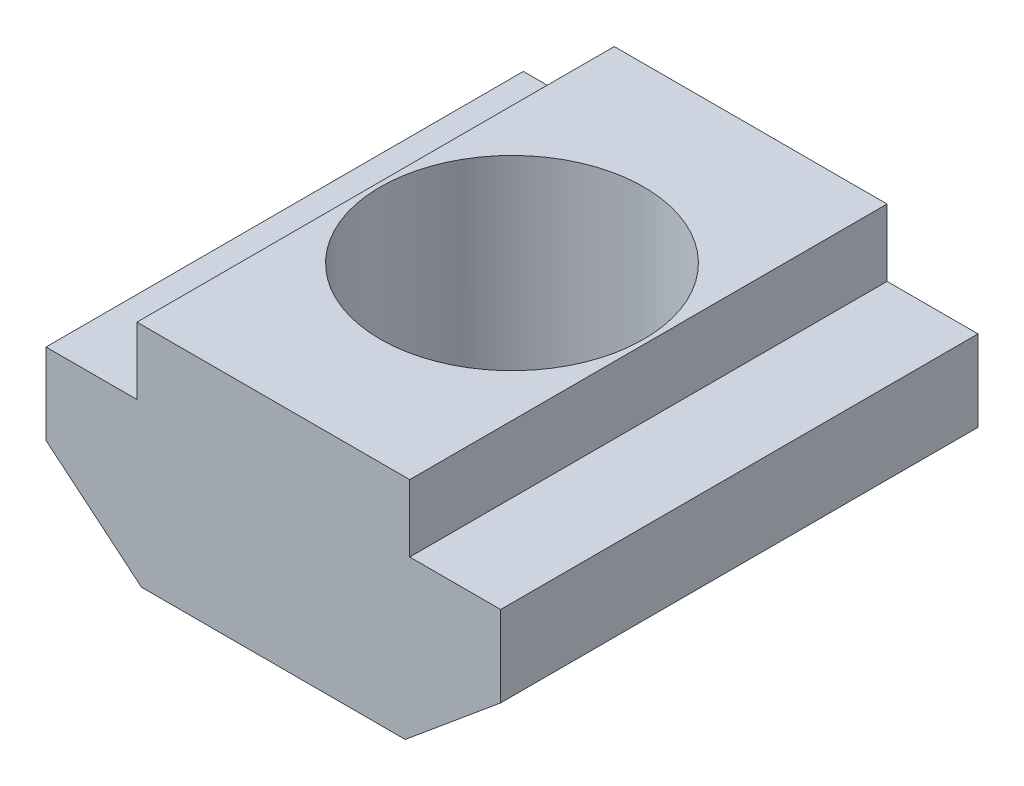
ISO-10303-21;
HEADER;
FILE_DESCRIPTION(('STEP AP214'),'2;1');
FILE_NAME('part.step','',(''),(''),'','','');
FILE_SCHEMA(('AUTOMOTIVE_DESIGN { 1 0 10303 214 1 1 1 1 }'));
ENDSEC;
DATA;
#1=APPLICATION_CONTEXT('core data for automotive mechanical design processes');
#2=APPLICATION_PROTOCOL_DEFINITION('international standard','automotive_design',2000,#1);
#3=PRODUCT_CONTEXT('',#1,'mechanical');
#4=PRODUCT('Part','Part','',(#3));
#5=PRODUCT_RELATED_PRODUCT_CATEGORY('part','',(#4));
#6=PRODUCT_DEFINITION_FORMATION('','',#4);
#7=PRODUCT_DEFINITION_CONTEXT('part definition',#1,'design');
#8=PRODUCT_DEFINITION('design','',#6,#7);
#9=PRODUCT_DEFINITION_SHAPE('','',#8);
#10=(LENGTH_UNIT() NAMED_UNIT(*) SI_UNIT(.MILLI.,.METRE.));
#11=(NAMED_UNIT(*) PLANE_ANGLE_UNIT() SI_UNIT($,.RADIAN.));
#12=(NAMED_UNIT(*) SI_UNIT($,.STERADIAN.) SOLID_ANGLE_UNIT());
#13=UNCERTAINTY_MEASURE_WITH_UNIT(LENGTH_MEASURE(1.E-05),#10,'distance_accuracy_value','');
#14=(GEOMETRIC_REPRESENTATION_CONTEXT(3) GLOBAL_UNCERTAINTY_ASSIGNED_CONTEXT((#13)) GLOBAL_UNIT_ASSIGNED_CONTEXT((#10,
#11,#12)) REPRESENTATION_CONTEXT('',''));
#15=CARTESIAN_POINT('',(0.,0.,0.));
#16=DIRECTION('',(0.,0.,1.));
#17=DIRECTION('',(1.,0.,0.));
#18=AXIS2_PLACEMENT_3D('',#15,#16,#17);
#19=CARTESIAN_POINT('',(-2.9,-2.5,10.5));
#20=DIRECTION('',(0.,1.,0.));
#21=DIRECTION('',(0.,0.,1.));
#22=AXIS2_PLACEMENT_3D('',#19,#20,#21);
#23=PLANE('',#22);
#24=DIRECTION('',(0.,0.,-1.));
#25=VECTOR('',#24,1.);
#26=CARTESIAN_POINT('',(2.9,-2.5,10.5));
#27=LINE('',#26,#25);
#28=CARTESIAN_POINT('',(2.9,-2.5,5.25));
#29=VERTEX_POINT('',#28);
#30=CARTESIAN_POINT('',(2.9,-2.5,0.));
#31=VERTEX_POINT('',#30);
#32=EDGE_CURVE('E101',#29,#31,#27,.T.);
#33=ORIENTED_EDGE('',*,*,#32,.F.);
#34=CARTESIAN_POINT('',(0.,-2.5,5.25));
#35=DIRECTION('',(0.,1.,0.));
#36=DIRECTION('',(0.,0.,1.));
#37=AXIS2_PLACEMENT_3D('',#34,#35,#36);
#38=CIRCLE('',#37,2.9);
#39=CARTESIAN_POINT('',(-2.9,-2.5,5.25));
#40=VERTEX_POINT('',#39);
#41=EDGE_CURVE('E53',#29,#40,#38,.T.);
#42=ORIENTED_EDGE('',*,*,#41,.T.);
#43=DIRECTION('',(0.,0.,-1.));
#44=VECTOR('',#43,1.);
#45=CARTESIAN_POINT('',(-2.9,-2.5,10.5));
#46=LINE('',#45,#44);
#47=CARTESIAN_POINT('',(-2.9,-2.5,0.));
#48=VERTEX_POINT('',#47);
#49=EDGE_CURVE('E182',#40,#48,#46,.T.);
#50=ORIENTED_EDGE('',*,*,#49,.T.);
#51=DIRECTION('',(1.,0.,0.));
#52=VECTOR('',#51,1.);
#53=CARTESIAN_POINT('',(-2.9,-2.5,0.));
#54=LINE('',#53,#52);
#55=EDGE_CURVE('E177',#48,#31,#54,.T.);
#56=ORIENTED_EDGE('',*,*,#55,.T.);
#57=EDGE_LOOP('',(#33,#42,#50,#56));
#58=FACE_BOUND('',#57,.T.);
#59=ADVANCED_FACE('F39',(#58),#23,.F.);
#60=CARTESIAN_POINT('',(2.9,-2.5,10.5));
#61=DIRECTION('',(-0.639326483940865,0.768935398412513,0.));
#62=DIRECTION('',(-0.768935398412514,-0.639326483940865,0.));
#63=AXIS2_PLACEMENT_3D('',#60,#61,#62);
#64=PLANE('',#63);
#65=DIRECTION('',(0.768935398412514,0.639326483940865,0.));
#66=VECTOR('',#65,1.);
#67=CARTESIAN_POINT('',(2.9,-2.5,0.));
#68=LINE('',#67,#66);
#69=CARTESIAN_POINT('',(5.,-0.753968253968255,0.));
#70=VERTEX_POINT('',#69);
#71=EDGE_CURVE('E160',#31,#70,#68,.T.);
#72=ORIENTED_EDGE('',*,*,#71,.T.);
#73=DIRECTION('',(0.,0.,-1.));
#74=VECTOR('',#73,1.);
#75=CARTESIAN_POINT('',(5.,-0.753968253968255,10.5));
#76=LINE('',#75,#74);
#77=CARTESIAN_POINT('',(5.,-0.753968253968255,10.5));
#78=VERTEX_POINT('',#77);
#79=EDGE_CURVE('E47',#78,#70,#76,.T.);
#80=ORIENTED_EDGE('',*,*,#79,.F.);
#81=DIRECTION('',(0.768935398412514,0.639326483940865,0.));
#82=VECTOR('',#81,1.);
#83=CARTESIAN_POINT('',(2.9,-2.5,10.5));
#84=LINE('',#83,#82);
#85=CARTESIAN_POINT('',(2.9,-2.5,10.5));
#86=VERTEX_POINT('',#85);
#87=EDGE_CURVE('E179',#86,#78,#84,.T.);
#88=ORIENTED_EDGE('',*,*,#87,.F.);
#89=EDGE_CURVE('E180',#86,#29,#27,.T.);
#90=ORIENTED_EDGE('',*,*,#89,.T.);
#91=ORIENTED_EDGE('',*,*,#32,.T.);
#92=EDGE_LOOP('',(#72,#80,#88,#90,#91));
#93=FACE_BOUND('',#92,.T.);
#94=ADVANCED_FACE('F41',(#93),#64,.F.);
#95=CARTESIAN_POINT('',(5.,-0.753968253968255,10.5));
#96=DIRECTION('',(-1.,0.,0.));
#97=DIRECTION('',(0.,0.,1.));
#98=AXIS2_PLACEMENT_3D('',#95,#96,#97);
#99=PLANE('',#98);
#100=DIRECTION('',(0.,1.,0.));
#101=VECTOR('',#100,1.);
#102=CARTESIAN_POINT('',(5.,-0.753968253968255,0.));
#103=LINE('',#102,#101);
#104=CARTESIAN_POINT('',(5.,1.02603174603174,0.));
#105=VERTEX_POINT('',#104);
#106=EDGE_CURVE('E162',#70,#105,#103,.T.);
#107=ORIENTED_EDGE('',*,*,#106,.T.);
#108=DIRECTION('',(0.,0.,-1.));
#109=VECTOR('',#108,1.);
#110=CARTESIAN_POINT('',(5.,1.02603174603174,10.5));
#111=LINE('',#110,#109);
#112=CARTESIAN_POINT('',(5.,1.02603174603174,10.5));
#113=VERTEX_POINT('',#112);
#114=EDGE_CURVE('E197',#113,#105,#111,.T.);
#115=ORIENTED_EDGE('',*,*,#114,.F.);
#116=DIRECTION('',(0.,1.,0.));
#117=VECTOR('',#116,1.);
#118=CARTESIAN_POINT('',(5.,-0.753968253968255,10.5));
#119=LINE('',#118,#117);
#120=EDGE_CURVE('E110',#78,#113,#119,.T.);
#121=ORIENTED_EDGE('',*,*,#120,.F.);
#122=ORIENTED_EDGE('',*,*,#79,.T.);
#123=EDGE_LOOP('',(#107,#115,#121,#122));
#124=FACE_BOUND('',#123,.T.);
#125=ADVANCED_FACE('F200',(#124),#99,.F.);
#126=CARTESIAN_POINT('',(5.,1.02603174603174,10.5));
#127=DIRECTION('',(0.,-1.,0.));
#128=DIRECTION('',(0.,0.,-1.));
#129=AXIS2_PLACEMENT_3D('',#126,#127,#128);
#130=PLANE('',#129);
#131=DIRECTION('',(-1.,0.,0.));
#132=VECTOR('',#131,1.);
#133=CARTESIAN_POINT('',(5.,1.02603174603174,0.));
#134=LINE('',#133,#132);
#135=CARTESIAN_POINT('',(3.,1.02603174603174,0.));
#136=VERTEX_POINT('',#135);
#137=EDGE_CURVE('E164',#105,#136,#134,.T.);
#138=ORIENTED_EDGE('',*,*,#137,.T.);
#139=DIRECTION('',(0.,0.,-1.));
#140=VECTOR('',#139,1.);
#141=CARTESIAN_POINT('',(3.,1.02603174603174,10.5));
#142=LINE('',#141,#140);
#143=CARTESIAN_POINT('',(3.,1.02603174603174,10.5));
#144=VERTEX_POINT('',#143);
#145=EDGE_CURVE('E194',#144,#136,#142,.T.);
#146=ORIENTED_EDGE('',*,*,#145,.F.);
#147=DIRECTION('',(-1.,0.,0.));
#148=VECTOR('',#147,1.);
#149=CARTESIAN_POINT('',(5.,1.02603174603174,10.5));
#150=LINE('',#149,#148);
#151=EDGE_CURVE('E220',#113,#144,#150,.T.);
#152=ORIENTED_EDGE('',*,*,#151,.F.);
#153=ORIENTED_EDGE('',*,*,#114,.T.);
#154=EDGE_LOOP('',(#138,#146,#152,#153));
#155=FACE_BOUND('',#154,.T.);
#156=ADVANCED_FACE('F211',(#155),#130,.F.);
#157=CARTESIAN_POINT('',(3.,1.02603174603174,10.5));
#158=DIRECTION('',(-1.,0.,0.));
#159=DIRECTION('',(0.,0.,1.));
#160=AXIS2_PLACEMENT_3D('',#157,#158,#159);
#161=PLANE('',#160);
#162=DIRECTION('',(0.,1.,0.));
#163=VECTOR('',#162,1.);
#164=CARTESIAN_POINT('',(3.,1.02603174603174,0.));
#165=LINE('',#164,#163);
#166=CARTESIAN_POINT('',(3.,2.5,0.));
#167=VERTEX_POINT('',#166);
#168=EDGE_CURVE('E166',#136,#167,#165,.T.);
#169=ORIENTED_EDGE('',*,*,#168,.T.);
#170=DIRECTION('',(0.,0.,-1.));
#171=VECTOR('',#170,1.);
#172=CARTESIAN_POINT('',(3.,2.5,10.5));
#173=LINE('',#172,#171);
#174=CARTESIAN_POINT('',(3.,2.5,10.5));
#175=VERTEX_POINT('',#174);
#176=EDGE_CURVE('E191',#175,#167,#173,.T.);
#177=ORIENTED_EDGE('',*,*,#176,.F.);
#178=DIRECTION('',(0.,1.,0.));
#179=VECTOR('',#178,1.);
#180=CARTESIAN_POINT('',(3.,1.02603174603174,10.5));
#181=LINE('',#180,#179);
#182=EDGE_CURVE('E217',#144,#175,#181,.T.);
#183=ORIENTED_EDGE('',*,*,#182,.F.);
#184=ORIENTED_EDGE('',*,*,#145,.T.);
#185=EDGE_LOOP('',(#169,#177,#183,#184));
#186=FACE_BOUND('',#185,.T.);
#187=ADVANCED_FACE('F215',(#186),#161,.F.);
#188=CARTESIAN_POINT('',(-3.,2.5,10.5));
#189=DIRECTION('',(0.,-1.,0.));
#190=DIRECTION('',(0.,0.,-1.));
#191=AXIS2_PLACEMENT_3D('',#188,#189,#190);
#192=PLANE('',#191);
#193=CARTESIAN_POINT('',(0.,2.5,5.25));
#194=DIRECTION('',(0.,1.,0.));
#195=DIRECTION('',(0.,0.,1.));
#196=AXIS2_PLACEMENT_3D('',#193,#194,#195);
#197=CIRCLE('',#196,2.9);
#198=CARTESIAN_POINT('',(0.,2.5,8.15));
#199=VERTEX_POINT('',#198);
#200=EDGE_CURVE('E241',#199,#199,#197,.T.);
#201=ORIENTED_EDGE('',*,*,#200,.F.);
#202=EDGE_LOOP('',(#201));
#203=FACE_BOUND('',#202,.T.);
#204=DIRECTION('',(-1.,0.,0.));
#205=VECTOR('',#204,1.);
#206=CARTESIAN_POINT('',(-3.,2.5,0.));
#207=LINE('',#206,#205);
#208=CARTESIAN_POINT('',(-3.,2.5,0.));
#209=VERTEX_POINT('',#208);
#210=EDGE_CURVE('E168',#167,#209,#207,.T.);
#211=ORIENTED_EDGE('',*,*,#210,.T.);
#212=DIRECTION('',(0.,0.,-1.));
#213=VECTOR('',#212,1.);
#214=CARTESIAN_POINT('',(-3.,2.5,10.5));
#215=LINE('',#214,#213);
#216=CARTESIAN_POINT('',(-3.,2.5,10.5));
#217=VERTEX_POINT('',#216);
#218=EDGE_CURVE('E188',#217,#209,#215,.T.);
#219=ORIENTED_EDGE('',*,*,#218,.F.);
#220=DIRECTION('',(-1.,0.,0.));
#221=VECTOR('',#220,1.);
#222=CARTESIAN_POINT('',(-3.,2.5,10.5));
#223=LINE('',#222,#221);
#224=EDGE_CURVE('E219',#175,#217,#223,.T.);
#225=ORIENTED_EDGE('',*,*,#224,.F.);
#226=ORIENTED_EDGE('',*,*,#176,.T.);
#227=EDGE_LOOP('',(#211,#219,#225,#226));
#228=FACE_BOUND('',#227,.T.);
#229=ADVANCED_FACE('F266',(#203,#228),#192,.F.);
#230=CARTESIAN_POINT('',(-3.,1.02603174603174,10.5));
#231=DIRECTION('',(1.,0.,0.));
#232=DIRECTION('',(0.,0.,-1.));
#233=AXIS2_PLACEMENT_3D('',#230,#231,#232);
#234=PLANE('',#233);
#235=DIRECTION('',(0.,-1.,0.));
#236=VECTOR('',#235,1.);
#237=CARTESIAN_POINT('',(-3.,1.02603174603174,0.));
#238=LINE('',#237,#236);
#239=CARTESIAN_POINT('',(-3.,1.02603174603174,0.));
#240=VERTEX_POINT('',#239);
#241=EDGE_CURVE('E170',#209,#240,#238,.T.);
#242=ORIENTED_EDGE('',*,*,#241,.T.);
#243=DIRECTION('',(0.,0.,-1.));
#244=VECTOR('',#243,1.);
#245=CARTESIAN_POINT('',(-3.,1.02603174603174,10.5));
#246=LINE('',#245,#244);
#247=CARTESIAN_POINT('',(-3.,1.02603174603174,10.5));
#248=VERTEX_POINT('',#247);
#249=EDGE_CURVE('E185',#248,#240,#246,.T.);
#250=ORIENTED_EDGE('',*,*,#249,.F.);
#251=DIRECTION('',(0.,-1.,0.));
#252=VECTOR('',#251,1.);
#253=CARTESIAN_POINT('',(-3.,1.02603174603174,10.5));
#254=LINE('',#253,#252);
#255=EDGE_CURVE('E222',#217,#248,#254,.T.);
#256=ORIENTED_EDGE('',*,*,#255,.F.);
#257=ORIENTED_EDGE('',*,*,#218,.T.);
#258=EDGE_LOOP('',(#242,#250,#256,#257));
#259=FACE_BOUND('',#258,.T.);
#260=ADVANCED_FACE('F231',(#259),#234,.F.);
#261=CARTESIAN_POINT('',(-5.,1.02603174603174,10.5));
#262=DIRECTION('',(0.,-1.,0.));
#263=DIRECTION('',(0.,0.,-1.));
#264=AXIS2_PLACEMENT_3D('',#261,#262,#263);
#265=PLANE('',#264);
#266=DIRECTION('',(-1.,0.,0.));
#267=VECTOR('',#266,1.);
#268=CARTESIAN_POINT('',(-5.,1.02603174603174,0.));
#269=LINE('',#268,#267);
#270=CARTESIAN_POINT('',(-5.,1.02603174603174,0.));
#271=VERTEX_POINT('',#270);
#272=EDGE_CURVE('E172',#240,#271,#269,.T.);
#273=ORIENTED_EDGE('',*,*,#272,.T.);
#274=DIRECTION('',(0.,0.,-1.));
#275=VECTOR('',#274,1.);
#276=CARTESIAN_POINT('',(-5.,1.02603174603174,10.5));
#277=LINE('',#276,#275);
#278=CARTESIAN_POINT('',(-5.,1.02603174603174,10.5));
#279=VERTEX_POINT('',#278);
#280=EDGE_CURVE('E150',#279,#271,#277,.T.);
#281=ORIENTED_EDGE('',*,*,#280,.F.);
#282=DIRECTION('',(-1.,0.,0.));
#283=VECTOR('',#282,1.);
#284=CARTESIAN_POINT('',(-5.,1.02603174603174,10.5));
#285=LINE('',#284,#283);
#286=EDGE_CURVE('E137',#248,#279,#285,.T.);
#287=ORIENTED_EDGE('',*,*,#286,.F.);
#288=ORIENTED_EDGE('',*,*,#249,.T.);
#289=EDGE_LOOP('',(#273,#281,#287,#288));
#290=FACE_BOUND('',#289,.T.);
#291=ADVANCED_FACE('F235',(#290),#265,.F.);
#292=CARTESIAN_POINT('',(-5.,-0.753968253968255,10.5));
#293=DIRECTION('',(1.,0.,0.));
#294=DIRECTION('',(0.,0.,-1.));
#295=AXIS2_PLACEMENT_3D('',#292,#293,#294);
#296=PLANE('',#295);
#297=DIRECTION('',(0.,-1.,0.));
#298=VECTOR('',#297,1.);
#299=CARTESIAN_POINT('',(-5.,-0.753968253968255,0.));
#300=LINE('',#299,#298);
#301=CARTESIAN_POINT('',(-5.,-0.753968253968255,0.));
#302=VERTEX_POINT('',#301);
#303=EDGE_CURVE('E146',#271,#302,#300,.T.);
#304=ORIENTED_EDGE('',*,*,#303,.T.);
#305=DIRECTION('',(0.,0.,-1.));
#306=VECTOR('',#305,1.);
#307=CARTESIAN_POINT('',(-5.,-0.753968253968255,10.5));
#308=LINE('',#307,#306);
#309=CARTESIAN_POINT('',(-5.,-0.753968253968255,10.5));
#310=VERTEX_POINT('',#309);
#311=EDGE_CURVE('E143',#310,#302,#308,.T.);
#312=ORIENTED_EDGE('',*,*,#311,.F.);
#313=DIRECTION('',(0.,-1.,0.));
#314=VECTOR('',#313,1.);
#315=CARTESIAN_POINT('',(-5.,-0.753968253968255,10.5));
#316=LINE('',#315,#314);
#317=EDGE_CURVE('E130',#279,#310,#316,.T.);
#318=ORIENTED_EDGE('',*,*,#317,.F.);
#319=ORIENTED_EDGE('',*,*,#280,.T.);
#320=EDGE_LOOP('',(#304,#312,#318,#319));
#321=FACE_BOUND('',#320,.T.);
#322=ADVANCED_FACE('F144',(#321),#296,.F.);
#323=CARTESIAN_POINT('',(-2.9,-2.5,10.5));
#324=DIRECTION('',(0.639326483940865,0.768935398412514,0.));
#325=DIRECTION('',(-0.768935398412514,0.639326483940865,0.));
#326=AXIS2_PLACEMENT_3D('',#323,#324,#325);
#327=PLANE('',#326);
#328=DIRECTION('',(0.768935398412514,-0.639326483940865,0.));
#329=VECTOR('',#328,1.);
#330=CARTESIAN_POINT('',(-2.9,-2.5,0.));
#331=LINE('',#330,#329);
#332=EDGE_CURVE('E175',#302,#48,#331,.T.);
#333=ORIENTED_EDGE('',*,*,#332,.T.);
#334=ORIENTED_EDGE('',*,*,#49,.F.);
#335=CARTESIAN_POINT('',(-2.9,-2.5,10.5));
#336=VERTEX_POINT('',#335);
#337=EDGE_CURVE('E151',#336,#40,#46,.T.);
#338=ORIENTED_EDGE('',*,*,#337,.F.);
#339=DIRECTION('',(0.768935398412514,-0.639326483940865,0.));
#340=VECTOR('',#339,1.);
#341=CARTESIAN_POINT('',(-2.9,-2.5,10.5));
#342=LINE('',#341,#340);
#343=EDGE_CURVE('E134',#310,#336,#342,.T.);
#344=ORIENTED_EDGE('',*,*,#343,.F.);
#345=ORIENTED_EDGE('',*,*,#311,.T.);
#346=EDGE_LOOP('',(#333,#334,#338,#344,#345));
#347=FACE_BOUND('',#346,.T.);
#348=ADVANCED_FACE('F153',(#347),#327,.F.);
#349=ORIENTED_EDGE('',*,*,#337,.T.);
#350=CARTESIAN_POINT('',(0.,-2.5,5.25));
#351=DIRECTION('',(0.,1.,0.));
#352=DIRECTION('',(0.,0.,1.));
#353=AXIS2_PLACEMENT_3D('',#350,#351,#352);
#354=CIRCLE('',#353,2.9);
#355=EDGE_CURVE('E11',#40,#29,#354,.T.);
#356=ORIENTED_EDGE('',*,*,#355,.T.);
#357=ORIENTED_EDGE('',*,*,#89,.F.);
#358=DIRECTION('',(1.,0.,0.));
#359=VECTOR('',#358,1.);
#360=CARTESIAN_POINT('',(-2.9,-2.5,10.5));
#361=LINE('',#360,#359);
#362=EDGE_CURVE('E61',#336,#86,#361,.T.);
#363=ORIENTED_EDGE('',*,*,#362,.F.);
#364=EDGE_LOOP('',(#349,#356,#357,#363));
#365=FACE_BOUND('',#364,.T.);
#366=ADVANCED_FACE('F238',(#365),#23,.F.);
#367=CARTESIAN_POINT('',(0.,0.,10.5));
#368=DIRECTION('',(0.,0.,1.));
#369=DIRECTION('',(1.,0.,0.));
#370=AXIS2_PLACEMENT_3D('',#367,#368,#369);
#371=PLANE('',#370);
#372=ORIENTED_EDGE('',*,*,#87,.T.);
#373=ORIENTED_EDGE('',*,*,#120,.T.);
#374=ORIENTED_EDGE('',*,*,#151,.T.);
#375=ORIENTED_EDGE('',*,*,#182,.T.);
#376=ORIENTED_EDGE('',*,*,#224,.T.);
#377=ORIENTED_EDGE('',*,*,#255,.T.);
#378=ORIENTED_EDGE('',*,*,#286,.T.);
#379=ORIENTED_EDGE('',*,*,#317,.T.);
#380=ORIENTED_EDGE('',*,*,#343,.T.);
#381=ORIENTED_EDGE('',*,*,#362,.T.);
#382=EDGE_LOOP('',(#372,#373,#374,#375,#376,#377,#378,#379,#380,#381));
#383=FACE_BOUND('',#382,.T.);
#384=ADVANCED_FACE('F132',(#383),#371,.T.);
#385=CARTESIAN_POINT('',(0.,0.,0.));
#386=DIRECTION('',(0.,0.,1.));
#387=DIRECTION('',(1.,0.,0.));
#388=AXIS2_PLACEMENT_3D('',#385,#386,#387);
#389=PLANE('',#388);
#390=ORIENTED_EDGE('',*,*,#71,.F.);
#391=ORIENTED_EDGE('',*,*,#55,.F.);
#392=ORIENTED_EDGE('',*,*,#332,.F.);
#393=ORIENTED_EDGE('',*,*,#303,.F.);
#394=ORIENTED_EDGE('',*,*,#272,.F.);
#395=ORIENTED_EDGE('',*,*,#241,.F.);
#396=ORIENTED_EDGE('',*,*,#210,.F.);
#397=ORIENTED_EDGE('',*,*,#168,.F.);
#398=ORIENTED_EDGE('',*,*,#137,.F.);
#399=ORIENTED_EDGE('',*,*,#106,.F.);
#400=EDGE_LOOP('',(#390,#391,#392,#393,#394,#395,#396,#397,#398,#399));
#401=FACE_BOUND('',#400,.T.);
#402=ADVANCED_FACE('F205',(#401),#389,.F.);
#403=CARTESIAN_POINT('',(0.,-2.5,5.25));
#404=DIRECTION('',(0.,1.,0.));
#405=DIRECTION('',(0.,0.,1.));
#406=AXIS2_PLACEMENT_3D('',#403,#404,#405);
#407=CYLINDRICAL_SURFACE('',#406,2.9);
#408=ORIENTED_EDGE('',*,*,#41,.F.);
#409=ORIENTED_EDGE('',*,*,#355,.F.);
#410=EDGE_LOOP('',(#408,#409));
#411=FACE_BOUND('',#410,.T.);
#412=ORIENTED_EDGE('',*,*,#200,.T.);
#413=EDGE_LOOP('',(#412));
#414=FACE_BOUND('',#413,.T.);
#415=ADVANCED_FACE('F318',(#411,#414),#407,.F.);
#416=CLOSED_SHELL('',(#59,#94,#125,#156,#187,#229,#260,#291,#322,#348,#366,#384,#402,#415));
#417=MANIFOLD_SOLID_BREP('B2',#416);
#418=ADVANCED_BREP_SHAPE_REPRESENTATION('',(#18,#417),#14);
#419=SHAPE_DEFINITION_REPRESENTATION(#9,#418);
ENDSEC;
END-ISO-10303-21;
